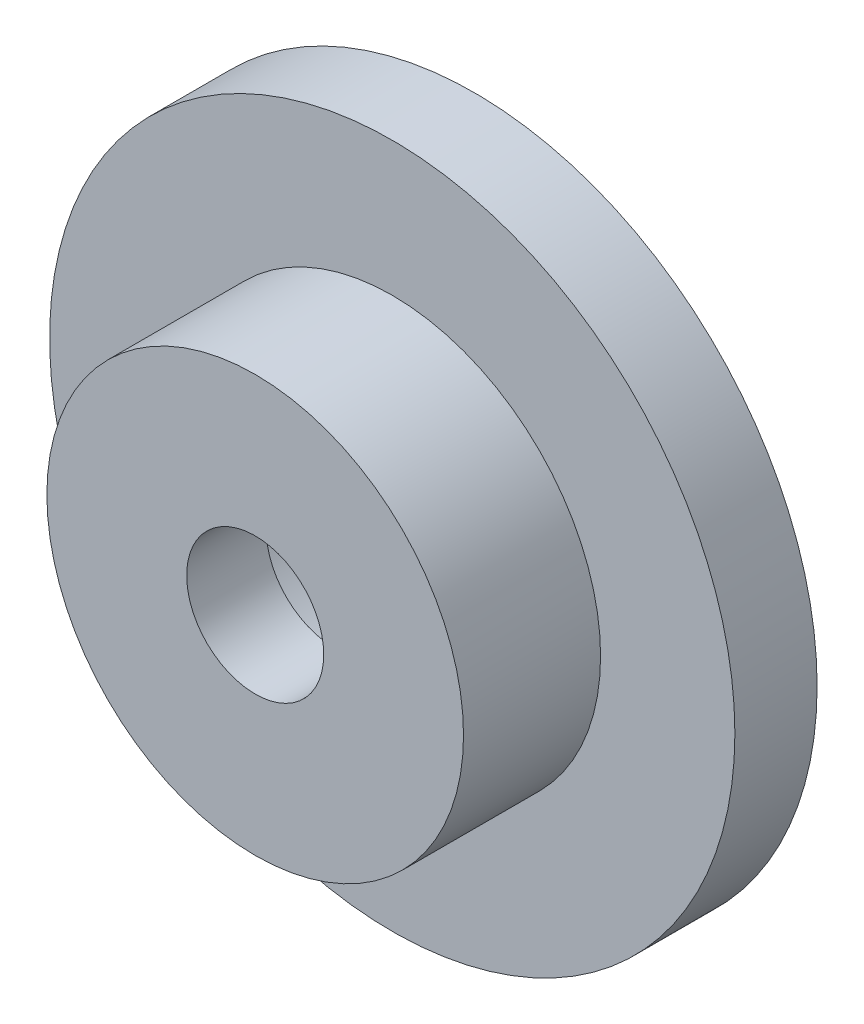
ISO-10303-21;
HEADER;
FILE_DESCRIPTION(('STEP AP214'),'2;1');
FILE_NAME('part.step','',(''),(''),'','','');
FILE_SCHEMA(('AUTOMOTIVE_DESIGN { 1 0 10303 214 1 1 1 1 }'));
ENDSEC;
DATA;
#1=APPLICATION_CONTEXT('core data for automotive mechanical design processes');
#2=APPLICATION_PROTOCOL_DEFINITION('international standard','automotive_design',2000,#1);
#3=PRODUCT_CONTEXT('',#1,'mechanical');
#4=PRODUCT('Part','Part','',(#3));
#5=PRODUCT_RELATED_PRODUCT_CATEGORY('part','',(#4));
#6=PRODUCT_DEFINITION_FORMATION('','',#4);
#7=PRODUCT_DEFINITION_CONTEXT('part definition',#1,'design');
#8=PRODUCT_DEFINITION('design','',#6,#7);
#9=PRODUCT_DEFINITION_SHAPE('','',#8);
#10=(LENGTH_UNIT() NAMED_UNIT(*) SI_UNIT(.MILLI.,.METRE.));
#11=(NAMED_UNIT(*) PLANE_ANGLE_UNIT() SI_UNIT($,.RADIAN.));
#12=(NAMED_UNIT(*) SI_UNIT($,.STERADIAN.) SOLID_ANGLE_UNIT());
#13=UNCERTAINTY_MEASURE_WITH_UNIT(LENGTH_MEASURE(1.E-05),#10,'distance_accuracy_value','');
#14=(GEOMETRIC_REPRESENTATION_CONTEXT(3) GLOBAL_UNCERTAINTY_ASSIGNED_CONTEXT((#13)) GLOBAL_UNIT_ASSIGNED_CONTEXT((#10,
#11,#12)) REPRESENTATION_CONTEXT('',''));
#15=CARTESIAN_POINT('',(0.,0.,0.));
#16=DIRECTION('',(0.,0.,1.));
#17=DIRECTION('',(1.,0.,0.));
#18=AXIS2_PLACEMENT_3D('',#15,#16,#17);
#19=CARTESIAN_POINT('',(0.,0.,3.));
#20=DIRECTION('',(0.,0.,-1.));
#21=DIRECTION('',(-1.,0.,0.));
#22=AXIS2_PLACEMENT_3D('',#19,#20,#21);
#23=CYLINDRICAL_SURFACE('',#22,12.5);
#24=CARTESIAN_POINT('',(0.,0.,3.));
#25=DIRECTION('',(0.,0.,1.));
#26=DIRECTION('',(1.,0.,0.));
#27=AXIS2_PLACEMENT_3D('',#24,#25,#26);
#28=CIRCLE('',#27,12.5);
#29=CARTESIAN_POINT('',(12.5,0.,3.));
#30=VERTEX_POINT('',#29);
#31=EDGE_CURVE('E22',#30,#30,#28,.T.);
#32=ORIENTED_EDGE('',*,*,#31,.F.);
#33=EDGE_LOOP('',(#32));
#34=FACE_BOUND('',#33,.T.);
#35=CARTESIAN_POINT('',(0.,0.,0.));
#36=DIRECTION('',(0.,0.,1.));
#37=DIRECTION('',(1.,0.,0.));
#38=AXIS2_PLACEMENT_3D('',#35,#36,#37);
#39=CIRCLE('',#38,12.5);
#40=CARTESIAN_POINT('',(12.5,0.,0.));
#41=VERTEX_POINT('',#40);
#42=EDGE_CURVE('E17',#41,#41,#39,.T.);
#43=ORIENTED_EDGE('',*,*,#42,.T.);
#44=EDGE_LOOP('',(#43));
#45=FACE_BOUND('',#44,.T.);
#46=ADVANCED_FACE('F14',(#34,#45),#23,.T.);
#47=CARTESIAN_POINT('',(0.,0.,3.));
#48=DIRECTION('',(0.,0.,1.));
#49=DIRECTION('',(1.,0.,0.));
#50=AXIS2_PLACEMENT_3D('',#47,#48,#49);
#51=PLANE('',#50);
#52=CARTESIAN_POINT('',(0.,0.,3.));
#53=DIRECTION('',(0.,0.,1.));
#54=DIRECTION('',(1.,0.,0.));
#55=AXIS2_PLACEMENT_3D('',#52,#53,#54);
#56=CIRCLE('',#55,7.6);
#57=CARTESIAN_POINT('',(7.6,0.,3.));
#58=VERTEX_POINT('',#57);
#59=EDGE_CURVE('E9',#58,#58,#56,.T.);
#60=ORIENTED_EDGE('',*,*,#59,.F.);
#61=EDGE_LOOP('',(#60));
#62=FACE_BOUND('',#61,.T.);
#63=ORIENTED_EDGE('',*,*,#31,.T.);
#64=EDGE_LOOP('',(#63));
#65=FACE_BOUND('',#64,.T.);
#66=ADVANCED_FACE('F80',(#62,#65),#51,.T.);
#67=CARTESIAN_POINT('',(0.,0.,0.));
#68=DIRECTION('',(0.,0.,1.));
#69=DIRECTION('',(1.,0.,0.));
#70=AXIS2_PLACEMENT_3D('',#67,#68,#69);
#71=PLANE('',#70);
#72=CARTESIAN_POINT('',(0.,0.,0.));
#73=DIRECTION('',(0.,0.,-1.));
#74=DIRECTION('',(-1.,0.,0.));
#75=AXIS2_PLACEMENT_3D('',#72,#73,#74);
#76=CIRCLE('',#75,6.1);
#77=CARTESIAN_POINT('',(-6.1,0.,0.));
#78=VERTEX_POINT('',#77);
#79=EDGE_CURVE('E38',#78,#78,#76,.T.);
#80=ORIENTED_EDGE('',*,*,#79,.F.);
#81=EDGE_LOOP('',(#80));
#82=FACE_BOUND('',#81,.T.);
#83=ORIENTED_EDGE('',*,*,#42,.F.);
#84=EDGE_LOOP('',(#83));
#85=FACE_BOUND('',#84,.T.);
#86=ADVANCED_FACE('F74',(#82,#85),#71,.F.);
#87=CARTESIAN_POINT('',(0.,0.,8.));
#88=DIRECTION('',(0.,0.,-1.));
#89=DIRECTION('',(-1.,0.,0.));
#90=AXIS2_PLACEMENT_3D('',#87,#88,#89);
#91=CYLINDRICAL_SURFACE('',#90,7.6);
#92=CARTESIAN_POINT('',(0.,0.,8.));
#93=DIRECTION('',(0.,0.,1.));
#94=DIRECTION('',(1.,0.,0.));
#95=AXIS2_PLACEMENT_3D('',#92,#93,#94);
#96=CIRCLE('',#95,7.6);
#97=CARTESIAN_POINT('',(7.6,0.,8.));
#98=VERTEX_POINT('',#97);
#99=EDGE_CURVE('E33',#98,#98,#96,.T.);
#100=ORIENTED_EDGE('',*,*,#99,.F.);
#101=EDGE_LOOP('',(#100));
#102=FACE_BOUND('',#101,.T.);
#103=ORIENTED_EDGE('',*,*,#59,.T.);
#104=EDGE_LOOP('',(#103));
#105=FACE_BOUND('',#104,.T.);
#106=ADVANCED_FACE('F69',(#102,#105),#91,.T.);
#107=CARTESIAN_POINT('',(0.,0.,8.));
#108=DIRECTION('',(0.,0.,1.));
#109=DIRECTION('',(1.,0.,0.));
#110=AXIS2_PLACEMENT_3D('',#107,#108,#109);
#111=PLANE('',#110);
#112=CARTESIAN_POINT('',(0.,0.,8.));
#113=DIRECTION('',(0.,0.,1.));
#114=DIRECTION('',(1.,0.,0.));
#115=AXIS2_PLACEMENT_3D('',#112,#113,#114);
#116=CIRCLE('',#115,2.5);
#117=CARTESIAN_POINT('',(2.5,0.,8.));
#118=VERTEX_POINT('',#117);
#119=EDGE_CURVE('E46',#118,#118,#116,.T.);
#120=ORIENTED_EDGE('',*,*,#119,.F.);
#121=EDGE_LOOP('',(#120));
#122=FACE_BOUND('',#121,.T.);
#123=ORIENTED_EDGE('',*,*,#99,.T.);
#124=EDGE_LOOP('',(#123));
#125=FACE_BOUND('',#124,.T.);
#126=ADVANCED_FACE('F65',(#122,#125),#111,.T.);
#127=CARTESIAN_POINT('',(0.,0.,5.1));
#128=DIRECTION('',(0.,0.,-1.));
#129=DIRECTION('',(-1.,0.,0.));
#130=AXIS2_PLACEMENT_3D('',#127,#128,#129);
#131=CYLINDRICAL_SURFACE('',#130,6.1);
#132=CARTESIAN_POINT('',(0.,0.,5.1));
#133=DIRECTION('',(0.,0.,-1.));
#134=DIRECTION('',(-1.,0.,0.));
#135=AXIS2_PLACEMENT_3D('',#132,#133,#134);
#136=CIRCLE('',#135,6.1);
#137=CARTESIAN_POINT('',(-6.1,0.,5.1));
#138=VERTEX_POINT('',#137);
#139=EDGE_CURVE('E37',#138,#138,#136,.T.);
#140=ORIENTED_EDGE('',*,*,#139,.F.);
#141=EDGE_LOOP('',(#140));
#142=FACE_BOUND('',#141,.T.);
#143=ORIENTED_EDGE('',*,*,#79,.T.);
#144=EDGE_LOOP('',(#143));
#145=FACE_BOUND('',#144,.T.);
#146=ADVANCED_FACE('F68',(#142,#145),#131,.F.);
#147=CARTESIAN_POINT('',(0.,0.,5.1));
#148=DIRECTION('',(0.,0.,-1.));
#149=DIRECTION('',(1.,0.,0.));
#150=AXIS2_PLACEMENT_3D('',#147,#148,#149);
#151=PLANE('',#150);
#152=CARTESIAN_POINT('',(0.,0.,5.1));
#153=DIRECTION('',(0.,0.,1.));
#154=DIRECTION('',(1.,0.,0.));
#155=AXIS2_PLACEMENT_3D('',#152,#153,#154);
#156=CIRCLE('',#155,2.5);
#157=CARTESIAN_POINT('',(2.5,0.,5.1));
#158=VERTEX_POINT('',#157);
#159=EDGE_CURVE('E42',#158,#158,#156,.T.);
#160=ORIENTED_EDGE('',*,*,#159,.T.);
#161=EDGE_LOOP('',(#160));
#162=FACE_BOUND('',#161,.T.);
#163=ORIENTED_EDGE('',*,*,#139,.T.);
#164=EDGE_LOOP('',(#163));
#165=FACE_BOUND('',#164,.T.);
#166=ADVANCED_FACE('F56',(#162,#165),#151,.T.);
#167=CARTESIAN_POINT('',(0.,0.,5.1));
#168=DIRECTION('',(0.,0.,1.));
#169=DIRECTION('',(1.,0.,0.));
#170=AXIS2_PLACEMENT_3D('',#167,#168,#169);
#171=CYLINDRICAL_SURFACE('',#170,2.5);
#172=ORIENTED_EDGE('',*,*,#159,.F.);
#173=EDGE_LOOP('',(#172));
#174=FACE_BOUND('',#173,.T.);
#175=ORIENTED_EDGE('',*,*,#119,.T.);
#176=EDGE_LOOP('',(#175));
#177=FACE_BOUND('',#176,.T.);
#178=ADVANCED_FACE('F59',(#174,#177),#171,.F.);
#179=CLOSED_SHELL('',(#46,#66,#86,#106,#126,#146,#166,#178));
#180=MANIFOLD_SOLID_BREP('B1',#179);
#181=ADVANCED_BREP_SHAPE_REPRESENTATION('',(#18,#180),#14);
#182=SHAPE_DEFINITION_REPRESENTATION(#9,#181);
ENDSEC;
END-ISO-10303-21;
